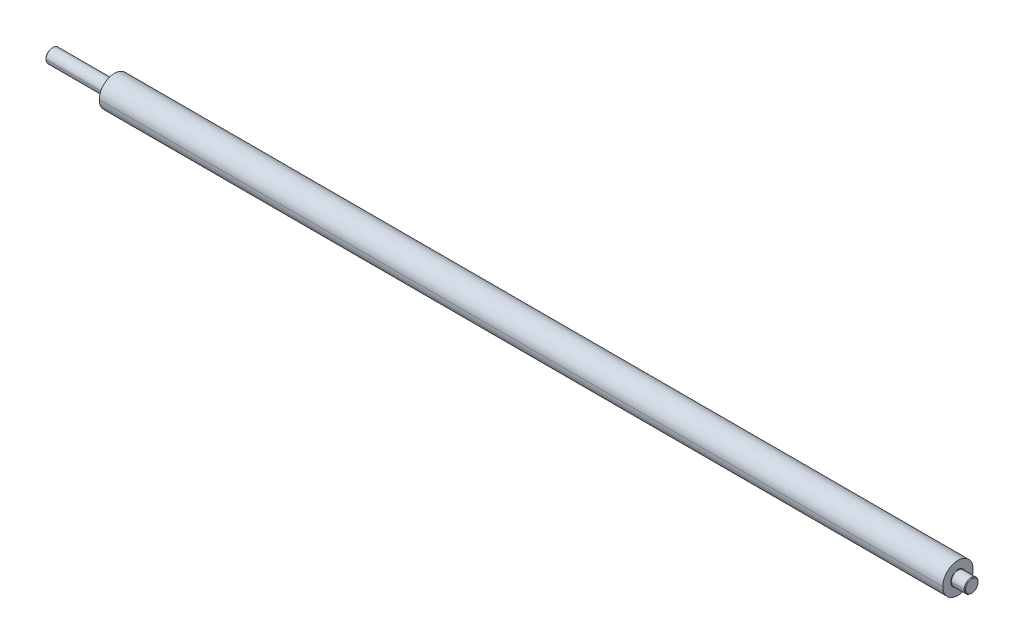
ISO-10303-21;
HEADER;
FILE_DESCRIPTION(('STEP AP214'),'2;1');
FILE_NAME('part.step','',(''),(''),'','','');
FILE_SCHEMA(('AUTOMOTIVE_DESIGN { 1 0 10303 214 1 1 1 1 }'));
ENDSEC;
DATA;
#1=APPLICATION_CONTEXT('core data for automotive mechanical design processes');
#2=APPLICATION_PROTOCOL_DEFINITION('international standard','automotive_design',2000,#1);
#3=PRODUCT_CONTEXT('',#1,'mechanical');
#4=PRODUCT('Part','Part','',(#3));
#5=PRODUCT_RELATED_PRODUCT_CATEGORY('part','',(#4));
#6=PRODUCT_DEFINITION_FORMATION('','',#4);
#7=PRODUCT_DEFINITION_CONTEXT('part definition',#1,'design');
#8=PRODUCT_DEFINITION('design','',#6,#7);
#9=PRODUCT_DEFINITION_SHAPE('','',#8);
#10=(LENGTH_UNIT() NAMED_UNIT(*) SI_UNIT(.MILLI.,.METRE.));
#11=(NAMED_UNIT(*) PLANE_ANGLE_UNIT() SI_UNIT($,.RADIAN.));
#12=(NAMED_UNIT(*) SI_UNIT($,.STERADIAN.) SOLID_ANGLE_UNIT());
#13=UNCERTAINTY_MEASURE_WITH_UNIT(LENGTH_MEASURE(1.E-05),#10,'distance_accuracy_value','');
#14=(GEOMETRIC_REPRESENTATION_CONTEXT(3) GLOBAL_UNCERTAINTY_ASSIGNED_CONTEXT((#13)) GLOBAL_UNIT_ASSIGNED_CONTEXT((#10,
#11,#12)) REPRESENTATION_CONTEXT('',''));
#15=CARTESIAN_POINT('',(0.,0.,0.));
#16=DIRECTION('',(0.,0.,1.));
#17=DIRECTION('',(1.,0.,0.));
#18=AXIS2_PLACEMENT_3D('',#15,#16,#17);
#19=CARTESIAN_POINT('',(45.,0.,0.));
#20=DIRECTION('',(1.,0.,0.));
#21=DIRECTION('',(0.,0.,-1.));
#22=AXIS2_PLACEMENT_3D('',#19,#20,#21);
#23=PLANE('',#22);
#24=CARTESIAN_POINT('',(45.,0.,0.));
#25=DIRECTION('',(1.,0.,0.));
#26=DIRECTION('',(0.,0.,-1.));
#27=AXIS2_PLACEMENT_3D('',#24,#25,#26);
#28=CIRCLE('',#27,11.);
#29=CARTESIAN_POINT('',(45.,0.,11.));
#30=VERTEX_POINT('',#29);
#31=CARTESIAN_POINT('',(45.,0.,-11.));
#32=VERTEX_POINT('',#31);
#33=EDGE_CURVE('E10',#30,#32,#28,.T.);
#34=ORIENTED_EDGE('',*,*,#33,.F.);
#35=CARTESIAN_POINT('',(45.,0.,0.));
#36=DIRECTION('',(1.,0.,0.));
#37=DIRECTION('',(0.,0.,-1.));
#38=AXIS2_PLACEMENT_3D('',#35,#36,#37);
#39=CIRCLE('',#38,11.);
#40=EDGE_CURVE('E25',#32,#30,#39,.T.);
#41=ORIENTED_EDGE('',*,*,#40,.F.);
#42=EDGE_LOOP('',(#34,#41));
#43=FACE_BOUND('',#42,.T.);
#44=CARTESIAN_POINT('',(45.,0.,0.));
#45=DIRECTION('',(1.,0.,0.));
#46=DIRECTION('',(0.,0.,-1.));
#47=AXIS2_PLACEMENT_3D('',#44,#45,#46);
#48=CIRCLE('',#47,5.3);
#49=CARTESIAN_POINT('',(44.9999999999999,5.0405995363642,1.63779007018718));
#50=VERTEX_POINT('',#49);
#51=CARTESIAN_POINT('',(44.9999999999999,-5.0405995363642,-1.63779007018718));
#52=VERTEX_POINT('',#51);
#53=EDGE_CURVE('E250',#50,#52,#48,.T.);
#54=ORIENTED_EDGE('',*,*,#53,.T.);
#55=CARTESIAN_POINT('',(45.,-5.04059953636431,-1.63779007018722));
#56=CARTESIAN_POINT('',(45.,-4.52559033783726,-3.22063693866093));
#57=CARTESIAN_POINT('',(45.,-3.3917749273373,-4.6057664224149));
#58=CARTESIAN_POINT('',(45.,-1.7315428505631,-5.44954277934704));
#59=CARTESIAN_POINT('',(45.,1.83934733064044,-5.66092899865932));
#60=CARTESIAN_POINT('',(45.,4.6040084700311,-3.39099736879158));
#61=CARTESIAN_POINT('',(45.,5.4512051359101,-1.73250802647092));
#62=CARTESIAN_POINT('',(45.,5.55432238842267,0.0545252424096536));
#63=CARTESIAN_POINT('',(45.,5.04059953636431,1.63779007018722));
#64=B_SPLINE_CURVE_WITH_KNOTS('',5,(#55,#56,#57,#58,#59,#60,#61,#62,#63),.UNSPECIFIED.,.F.,.F.,
(6,3,6),(0.,1.5707963267949,3.14159265358979),.UNSPECIFIED.);
#65=EDGE_CURVE('E253',#52,#50,#64,.T.);
#66=ORIENTED_EDGE('',*,*,#65,.T.);
#67=EDGE_LOOP('',(#54,#66));
#68=FACE_BOUND('',#67,.T.);
#69=ADVANCED_FACE('F16',(#43,#68),#23,.F.);
#70=CARTESIAN_POINT('',(44.7,0.,0.));
#71=DIRECTION('',(1.,0.,0.));
#72=DIRECTION('',(0.,-0.309016994374947,0.951056516295154));
#73=AXIS2_PLACEMENT_3D('',#70,#71,#72);
#74=TOROIDAL_SURFACE('',#73,5.29999999999988,0.29999999999988);
#75=CARTESIAN_POINT('',(44.7,-5.0405995363642,-1.63779007018718));
#76=DIRECTION('',(0.,0.309016994374946,-0.951056516295154));
#77=DIRECTION('',(0.,0.951056516295154,0.309016994374946));
#78=AXIS2_PLACEMENT_3D('',#75,#76,#77);
#79=CIRCLE('',#78,0.29999999999988);
#80=CARTESIAN_POINT('',(44.7,-4.75528258147577,-1.54508497187474));
#81=VERTEX_POINT('',#80);
#82=EDGE_CURVE('E260',#81,#52,#79,.T.);
#83=ORIENTED_EDGE('',*,*,#82,.F.);
#84=CARTESIAN_POINT('',(44.7,0.,0.));
#85=DIRECTION('',(1.,0.,0.));
#86=DIRECTION('',(0.,0.,-1.));
#87=AXIS2_PLACEMENT_3D('',#84,#85,#86);
#88=CIRCLE('',#87,5.);
#89=CARTESIAN_POINT('',(44.7,0.,-5.));
#90=VERTEX_POINT('',#89);
#91=EDGE_CURVE('E264',#81,#90,#88,.T.);
#92=ORIENTED_EDGE('',*,*,#91,.T.);
#93=CARTESIAN_POINT('',(44.7,0.,0.));
#94=DIRECTION('',(1.,0.,0.));
#95=DIRECTION('',(0.,0.,-1.));
#96=AXIS2_PLACEMENT_3D('',#93,#94,#95);
#97=CIRCLE('',#96,5.);
#98=CARTESIAN_POINT('',(44.7,4.75528258147577,1.54508497187474));
#99=VERTEX_POINT('',#98);
#100=EDGE_CURVE('E274',#90,#99,#97,.T.);
#101=ORIENTED_EDGE('',*,*,#100,.T.);
#102=CARTESIAN_POINT('',(44.7,5.0405995363642,1.63779007018718));
#103=DIRECTION('',(0.,-0.309016994374946,0.951056516295154));
#104=DIRECTION('',(0.,-0.951056516295154,-0.309016994374946));
#105=AXIS2_PLACEMENT_3D('',#102,#103,#104);
#106=CIRCLE('',#105,0.29999999999988);
#107=EDGE_CURVE('E267',#99,#50,#106,.T.);
#108=ORIENTED_EDGE('',*,*,#107,.T.);
#109=ORIENTED_EDGE('',*,*,#65,.F.);
#110=EDGE_LOOP('',(#83,#92,#101,#108,#109));
#111=FACE_BOUND('',#110,.T.);
#112=ADVANCED_FACE('F242',(#111),#74,.F.);
#113=CARTESIAN_POINT('',(44.7,0.,0.));
#114=DIRECTION('',(1.,0.,0.));
#115=DIRECTION('',(0.,0.309016994374947,-0.951056516295154));
#116=AXIS2_PLACEMENT_3D('',#113,#114,#115);
#117=TOROIDAL_SURFACE('',#116,5.29999999999988,0.29999999999988);
#118=ORIENTED_EDGE('',*,*,#82,.T.);
#119=ORIENTED_EDGE('',*,*,#53,.F.);
#120=ORIENTED_EDGE('',*,*,#107,.F.);
#121=CARTESIAN_POINT('',(44.7,0.,0.));
#122=DIRECTION('',(1.,0.,0.));
#123=DIRECTION('',(0.,0.,-1.));
#124=AXIS2_PLACEMENT_3D('',#121,#122,#123);
#125=CIRCLE('',#124,5.);
#126=CARTESIAN_POINT('',(44.7,0.,5.));
#127=VERTEX_POINT('',#126);
#128=EDGE_CURVE('E275',#99,#127,#125,.T.);
#129=ORIENTED_EDGE('',*,*,#128,.T.);
#130=CARTESIAN_POINT('',(44.7,0.,0.));
#131=DIRECTION('',(1.,0.,0.));
#132=DIRECTION('',(0.,0.,-1.));
#133=AXIS2_PLACEMENT_3D('',#130,#131,#132);
#134=CIRCLE('',#133,5.);
#135=EDGE_CURVE('E262',#127,#81,#134,.T.);
#136=ORIENTED_EDGE('',*,*,#135,.T.);
#137=EDGE_LOOP('',(#118,#119,#120,#129,#136));
#138=FACE_BOUND('',#137,.T.);
#139=ADVANCED_FACE('F246',(#138),#117,.F.);
#140=CARTESIAN_POINT('',(45.,0.,0.));
#141=DIRECTION('',(1.,0.,0.));
#142=DIRECTION('',(0.,1.,0.));
#143=AXIS2_PLACEMENT_3D('',#140,#141,#142);
#144=CYLINDRICAL_SURFACE('',#143,5.);
#145=DIRECTION('',(1.,0.,0.));
#146=VECTOR('',#145,1.);
#147=CARTESIAN_POINT('',(0.5,0.,5.));
#148=LINE('',#147,#146);
#149=CARTESIAN_POINT('',(0.500000000000001,0.,5.));
#150=VERTEX_POINT('',#149);
#151=EDGE_CURVE('E347',#150,#127,#148,.T.);
#152=ORIENTED_EDGE('',*,*,#151,.F.);
#153=CARTESIAN_POINT('',(0.5,0.,0.));
#154=DIRECTION('',(1.,0.,0.));
#155=DIRECTION('',(0.,0.,-1.));
#156=AXIS2_PLACEMENT_3D('',#153,#154,#155);
#157=CIRCLE('',#156,5.);
#158=CARTESIAN_POINT('',(0.5,0.,-5.));
#159=VERTEX_POINT('',#158);
#160=EDGE_CURVE('E343',#150,#159,#157,.T.);
#161=ORIENTED_EDGE('',*,*,#160,.T.);
#162=DIRECTION('',(1.,0.,0.));
#163=VECTOR('',#162,1.);
#164=CARTESIAN_POINT('',(0.5,0.,-5.));
#165=LINE('',#164,#163);
#166=EDGE_CURVE('E338',#159,#90,#165,.T.);
#167=ORIENTED_EDGE('',*,*,#166,.T.);
#168=ORIENTED_EDGE('',*,*,#91,.F.);
#169=ORIENTED_EDGE('',*,*,#135,.F.);
#170=EDGE_LOOP('',(#152,#161,#167,#168,#169));
#171=FACE_BOUND('',#170,.T.);
#172=ADVANCED_FACE('F365',(#171),#144,.T.);
#173=CARTESIAN_POINT('',(45.,0.,0.));
#174=DIRECTION('',(1.,0.,0.));
#175=DIRECTION('',(0.,-1.,0.));
#176=AXIS2_PLACEMENT_3D('',#173,#174,#175);
#177=CYLINDRICAL_SURFACE('',#176,5.);
#178=ORIENTED_EDGE('',*,*,#151,.T.);
#179=ORIENTED_EDGE('',*,*,#128,.F.);
#180=ORIENTED_EDGE('',*,*,#100,.F.);
#181=ORIENTED_EDGE('',*,*,#166,.F.);
#182=CARTESIAN_POINT('',(0.5,0.,0.));
#183=DIRECTION('',(1.,0.,0.));
#184=DIRECTION('',(0.,0.,-1.));
#185=AXIS2_PLACEMENT_3D('',#182,#183,#184);
#186=CIRCLE('',#185,5.);
#187=EDGE_CURVE('E333',#159,#150,#186,.T.);
#188=ORIENTED_EDGE('',*,*,#187,.T.);
#189=EDGE_LOOP('',(#178,#179,#180,#181,#188));
#190=FACE_BOUND('',#189,.T.);
#191=ADVANCED_FACE('F361',(#190),#177,.T.);
#192=CARTESIAN_POINT('',(0.,0.,0.));
#193=DIRECTION('',(1.,0.,0.));
#194=DIRECTION('',(0.,-1.,0.));
#195=AXIS2_PLACEMENT_3D('',#192,#193,#194);
#196=CONICAL_SURFACE('',#195,4.5,0.785398163397448);
#197=DIRECTION('',(0.707106781186548,0.,0.707106781186547));
#198=VECTOR('',#197,1.);
#199=CARTESIAN_POINT('',(0.,0.,4.5));
#200=LINE('',#199,#198);
#201=CARTESIAN_POINT('',(0.,0.,4.5));
#202=VERTEX_POINT('',#201);
#203=EDGE_CURVE('E328',#202,#150,#200,.T.);
#204=ORIENTED_EDGE('',*,*,#203,.T.);
#205=ORIENTED_EDGE('',*,*,#187,.F.);
#206=DIRECTION('',(0.707106781186548,0.,-0.707106781186547));
#207=VECTOR('',#206,1.);
#208=CARTESIAN_POINT('',(0.,0.,-4.5));
#209=LINE('',#208,#207);
#210=CARTESIAN_POINT('',(0.,0.,-4.5));
#211=VERTEX_POINT('',#210);
#212=EDGE_CURVE('E323',#211,#159,#209,.T.);
#213=ORIENTED_EDGE('',*,*,#212,.F.);
#214=CARTESIAN_POINT('',(0.,0.,0.));
#215=DIRECTION('',(1.,0.,0.));
#216=DIRECTION('',(0.,0.,-1.));
#217=AXIS2_PLACEMENT_3D('',#214,#215,#216);
#218=CIRCLE('',#217,4.5);
#219=EDGE_CURVE('E312',#211,#202,#218,.T.);
#220=ORIENTED_EDGE('',*,*,#219,.T.);
#221=EDGE_LOOP('',(#204,#205,#213,#220));
#222=FACE_BOUND('',#221,.T.);
#223=ADVANCED_FACE('F373',(#222),#196,.T.);
#224=CARTESIAN_POINT('',(0.,0.,0.));
#225=DIRECTION('',(1.,0.,0.));
#226=DIRECTION('',(0.,0.,-1.));
#227=AXIS2_PLACEMENT_3D('',#224,#225,#226);
#228=PLANE('',#227);
#229=CARTESIAN_POINT('',(0.,0.,0.));
#230=DIRECTION('',(1.,0.,0.));
#231=DIRECTION('',(0.,0.,-1.));
#232=AXIS2_PLACEMENT_3D('',#229,#230,#231);
#233=CIRCLE('',#232,4.5);
#234=EDGE_CURVE('E309',#202,#211,#233,.T.);
#235=ORIENTED_EDGE('',*,*,#234,.F.);
#236=ORIENTED_EDGE('',*,*,#219,.F.);
#237=EDGE_LOOP('',(#235,#236));
#238=FACE_BOUND('',#237,.T.);
#239=ADVANCED_FACE('F375',(#238),#228,.F.);
#240=CARTESIAN_POINT('',(0.,0.,0.));
#241=DIRECTION('',(1.,0.,0.));
#242=DIRECTION('',(0.,1.,0.));
#243=AXIS2_PLACEMENT_3D('',#240,#241,#242);
#244=CONICAL_SURFACE('',#243,4.5,0.785398163397448);
#245=ORIENTED_EDGE('',*,*,#203,.F.);
#246=ORIENTED_EDGE('',*,*,#234,.T.);
#247=ORIENTED_EDGE('',*,*,#212,.T.);
#248=ORIENTED_EDGE('',*,*,#160,.F.);
#249=EDGE_LOOP('',(#245,#246,#247,#248));
#250=FACE_BOUND('',#249,.T.);
#251=ADVANCED_FACE('F369',(#250),#244,.T.);
#252=CARTESIAN_POINT('',(655.,0.,0.));
#253=DIRECTION('',(1.,0.,0.));
#254=DIRECTION('',(0.,-1.,0.));
#255=AXIS2_PLACEMENT_3D('',#252,#253,#254);
#256=CYLINDRICAL_SURFACE('',#255,11.);
#257=DIRECTION('',(1.,0.,0.));
#258=VECTOR('',#257,1.);
#259=CARTESIAN_POINT('',(45.,0.,11.));
#260=LINE('',#259,#258);
#261=CARTESIAN_POINT('',(655.,0.,11.));
#262=VERTEX_POINT('',#261);
#263=EDGE_CURVE('E300',#30,#262,#260,.T.);
#264=ORIENTED_EDGE('',*,*,#263,.T.);
#265=CARTESIAN_POINT('',(655.,0.,0.));
#266=DIRECTION('',(1.,0.,0.));
#267=DIRECTION('',(0.,0.,-1.));
#268=AXIS2_PLACEMENT_3D('',#265,#266,#267);
#269=CIRCLE('',#268,11.);
#270=CARTESIAN_POINT('',(655.,0.,-11.));
#271=VERTEX_POINT('',#270);
#272=EDGE_CURVE('E305',#271,#262,#269,.T.);
#273=ORIENTED_EDGE('',*,*,#272,.F.);
#274=DIRECTION('',(1.,0.,0.));
#275=VECTOR('',#274,1.);
#276=CARTESIAN_POINT('',(45.,0.,-11.));
#277=LINE('',#276,#275);
#278=EDGE_CURVE('E303',#32,#271,#277,.T.);
#279=ORIENTED_EDGE('',*,*,#278,.F.);
#280=ORIENTED_EDGE('',*,*,#40,.T.);
#281=EDGE_LOOP('',(#264,#273,#279,#280));
#282=FACE_BOUND('',#281,.T.);
#283=ADVANCED_FACE('F299',(#282),#256,.T.);
#284=CARTESIAN_POINT('',(655.,0.,0.));
#285=DIRECTION('',(1.,0.,0.));
#286=DIRECTION('',(0.,1.,0.));
#287=AXIS2_PLACEMENT_3D('',#284,#285,#286);
#288=CYLINDRICAL_SURFACE('',#287,11.);
#289=ORIENTED_EDGE('',*,*,#263,.F.);
#290=ORIENTED_EDGE('',*,*,#33,.T.);
#291=ORIENTED_EDGE('',*,*,#278,.T.);
#292=CARTESIAN_POINT('',(655.,0.,0.));
#293=DIRECTION('',(1.,0.,0.));
#294=DIRECTION('',(0.,0.,-1.));
#295=AXIS2_PLACEMENT_3D('',#292,#293,#294);
#296=CIRCLE('',#295,11.);
#297=EDGE_CURVE('E221',#262,#271,#296,.T.);
#298=ORIENTED_EDGE('',*,*,#297,.F.);
#299=EDGE_LOOP('',(#289,#290,#291,#298));
#300=FACE_BOUND('',#299,.T.);
#301=ADVANCED_FACE('F190',(#300),#288,.T.);
#302=CARTESIAN_POINT('',(655.,11.,0.));
#303=DIRECTION('',(-1.,0.,0.));
#304=DIRECTION('',(0.,0.,1.));
#305=AXIS2_PLACEMENT_3D('',#302,#303,#304);
#306=PLANE('',#305);
#307=CARTESIAN_POINT('',(655.000000000007,5.04059953635766,1.63779007018506));
#308=CARTESIAN_POINT('',(655.000000000007,5.01380298147387,1.72026733897911));
#309=CARTESIAN_POINT('',(655.000000000007,4.98497875743653,1.80208561354296));
#310=CARTESIAN_POINT('',(655.000000000007,4.92335196993028,1.96420994002448));
#311=CARTESIAN_POINT('',(655.000000000007,4.89054940646136,2.04451599194214));
#312=CARTESIAN_POINT('',(655.000000000007,4.82104293896746,2.20342163894554));
#313=CARTESIAN_POINT('',(655.000000000007,4.78433903494247,2.28202123403126));
#314=CARTESIAN_POINT('',(655.000000000007,4.70711885195318,2.43732482034847));
#315=CARTESIAN_POINT('',(655.000000000007,4.66660257298888,2.51402881157995));
#316=CARTESIAN_POINT('',(655.000000000007,4.58185510197056,2.66535634828093));
#317=CARTESIAN_POINT('',(655.000000000007,4.53762390991653,2.73997989375044));
#318=CARTESIAN_POINT('',(655.000000000007,4.4455532084985,2.88696677908092));
#319=CARTESIAN_POINT('',(655.000000000007,4.39771369913449,2.9593301189419));
#320=CARTESIAN_POINT('',(655.000000000007,4.29854160222447,3.10162225946278));
#321=CARTESIAN_POINT('',(655.000000000007,4.24720901467845,3.1715510601227));
#322=CARTESIAN_POINT('',(655.000000000007,4.14117442890147,3.30880565869899));
#323=CARTESIAN_POINT('',(655.000000000007,4.08647243067052,3.37613145661538));
#324=CARTESIAN_POINT('',(655.000000000007,3.97383080467916,3.50801785567547));
#325=CARTESIAN_POINT('',(655.000000000007,3.91589117691876,3.57257845681918));
#326=CARTESIAN_POINT('',(655.000000000007,3.79691387370755,3.69877893026726));
#327=CARTESIAN_POINT('',(655.000000000007,3.73587619825673,3.76041880257163));
#328=CARTESIAN_POINT('',(655.000000000007,3.61084984471731,3.88062932246921));
#329=CARTESIAN_POINT('',(655.000000000007,3.5468611666287,3.9391999700624));
#330=CARTESIAN_POINT('',(655.000000000007,3.41608696215835,4.05313093872286));
#331=CARTESIAN_POINT('',(655.000000000007,3.34930143577662,4.10849125979011));
#332=CARTESIAN_POINT('',(655.000000000007,3.21309442689896,4.21586820753478));
#333=CARTESIAN_POINT('',(655.000000000007,3.14367294440302,4.26788483421219));
#334=CARTESIAN_POINT('',(655.000000000007,3.00236126572991,4.36844908056778));
#335=CARTESIAN_POINT('',(655.000000000007,2.93047106955274,4.41699670024596));
#336=CARTESIAN_POINT('',(655.000000000007,2.78439515329632,4.51050597713489));
#337=CARTESIAN_POINT('',(655.000000000007,2.71020943321706,4.55546763434564));
#338=CARTESIAN_POINT('',(655.000000000007,2.55972118905412,4.64169666972937));
#339=CARTESIAN_POINT('',(655.000000000007,2.48341866497043,4.68296404790234));
#340=CARTESIAN_POINT('',(655.000000000007,2.32888063226242,4.76170510848188));
#341=CARTESIAN_POINT('',(655.000000000007,2.2506451236381,4.79917879088844));
#342=CARTESIAN_POINT('',(655.000000000007,2.09242959804174,4.87024218255194));
#343=CARTESIAN_POINT('',(655.000000000007,2.0124495810697,4.90383189180887));
#344=CARTESIAN_POINT('',(655.000000000007,1.85093771764419,4.9670464166214));
#345=CARTESIAN_POINT('',(655.000000000007,1.76940587119073,4.996671232177));
#346=CARTESIAN_POINT('',(655.000000000007,1.60498676616185,5.05188460081134));
#347=CARTESIAN_POINT('',(655.000000000007,1.52209950758642,5.07747315389009));
#348=CARTESIAN_POINT('',(655.000000000007,1.35516926097958,5.12455235250509));
#349=CARTESIAN_POINT('',(655.000000000007,1.27112627294816,5.14604299804134));
#350=CARTESIAN_POINT('',(655.000000000007,1.1020870343488,5.18487460872389));
#351=CARTESIAN_POINT('',(655.000000000007,1.01709078378086,5.20221557387018));
#352=CARTESIAN_POINT('',(655.000000000007,0.846349783520853,5.23270604786889));
#353=CARTESIAN_POINT('',(655.000000000007,0.760605033828793,5.2458555567213));
#354=CARTESIAN_POINT('',(655.000000000007,0.588573601932919,5.26793143981365));
#355=CARTESIAN_POINT('',(655.000000000007,0.502286919729104,5.27685781405359));
#356=CARTESIAN_POINT('',(655.000000000007,0.329379494984969,5.29046592350361));
#357=CARTESIAN_POINT('',(655.000000000007,0.242758752444648,5.29514765871368));
#358=CARTESIAN_POINT('',(655.000000000007,0.0693918839833636,5.30025521139375));
#359=CARTESIAN_POINT('',(655.000000000007,-0.0173542419376003,5.30068102886376));
#360=CARTESIAN_POINT('',(655.000000000007,-0.190762898144767,5.29727572023213));
#361=CARTESIAN_POINT('',(655.000000000007,-0.27742542843097,5.29344459413049));
#362=CARTESIAN_POINT('',(655.000000000007,-0.450458115742413,5.28153462787391));
#363=CARTESIAN_POINT('',(655.000000000007,-0.536828272767652,5.27345578771897));
#364=CARTESIAN_POINT('',(655.000000000007,-0.709068140283764,5.25306985598935));
#365=CARTESIAN_POINT('',(655.000000000007,-0.794937850774635,5.24076276441466));
#366=CARTESIAN_POINT('',(655.000000000007,-0.965969957568138,5.21194997870713));
#367=CARTESIAN_POINT('',(655.000000000007,-1.05113235387077,5.19544428457428));
#368=CARTESIAN_POINT('',(655.000000000007,-1.22054466861575,5.1582740574133));
#369=CARTESIAN_POINT('',(655.000000000007,-1.3047945870581,5.13760952438518));
#370=CARTESIAN_POINT('',(655.000000000007,-1.47217898064958,5.09217140210372));
#371=CARTESIAN_POINT('',(655.000000000007,-1.55531345579871,5.06739781285039));
#372=CARTESIAN_POINT('',(655.000000000007,-1.72026668457138,5.01380125986493));
#373=CARTESIAN_POINT('',(655.000000000007,-1.80208543819493,4.98497829613281));
#374=CARTESIAN_POINT('',(655.000000000007,-1.96421011537249,4.92335243123401));
#375=CARTESIAN_POINT('',(655.000000000007,-2.04451603892649,4.89054953006732));
#376=CARTESIAN_POINT('',(655.000000000007,-2.20342159196117,4.8210428153615));
#377=CARTESIAN_POINT('',(655.000000000007,-2.28202122144183,4.78433900182236));
#378=CARTESIAN_POINT('',(655.000000000007,-2.43732483293788,4.70711888507331));
#379=CARTESIAN_POINT('',(655.000000000007,-2.51402881495326,4.6666025818634));
#380=CARTESIAN_POINT('',(655.000000000007,-2.6653563449076,4.58185509309605));
#381=CARTESIAN_POINT('',(655.000000000007,-2.73997989284655,4.53762390753861));
#382=CARTESIAN_POINT('',(655.000000000007,-2.8869667799848,4.44555321087642));
#383=CARTESIAN_POINT('',(655.000000000007,-2.95933011918408,4.39771369977166));
#384=CARTESIAN_POINT('',(655.000000000007,-3.10162225922058,4.29854160158731));
#385=CARTESIAN_POINT('',(655.000000000007,-3.17155106005779,4.24720901450773));
#386=CARTESIAN_POINT('',(655.000000000007,-3.30880565876388,4.14117442907221));
#387=CARTESIAN_POINT('',(655.000000000007,-3.37613145663276,4.08647243071627));
#388=CARTESIAN_POINT('',(655.000000000007,-3.50801785565807,3.97383080463343));
#389=CARTESIAN_POINT('',(655.000000000007,-3.57257845681451,3.91589117690651));
#390=CARTESIAN_POINT('',(655.000000000007,-3.69877893027191,3.79691387371981));
#391=CARTESIAN_POINT('',(655.000000000007,-3.76041880257288,3.73587619826003));
#392=CARTESIAN_POINT('',(655.000000000007,-3.88062932246795,3.61084984471403));
#393=CARTESIAN_POINT('',(655.000000000007,-3.93919997006206,3.54686116662782));
#394=CARTESIAN_POINT('',(655.000000000007,-4.05313093872318,3.41608696215924));
#395=CARTESIAN_POINT('',(655.000000000007,-4.1084912597902,3.34930143577687));
#396=CARTESIAN_POINT('',(655.000000000007,-4.21586820753469,3.21309442689873));
#397=CARTESIAN_POINT('',(655.000000000007,-4.26788483421217,3.14367294440296));
#398=CARTESIAN_POINT('',(655.000000000007,-4.3684490805678,3.00236126572998));
#399=CARTESIAN_POINT('',(655.000000000007,-4.41699670024596,2.93047106955277));
#400=CARTESIAN_POINT('',(655.000000000007,-4.51050597713487,2.78439515329631));
#401=CARTESIAN_POINT('',(655.000000000007,-4.55546763434563,2.71020943321707));
#402=CARTESIAN_POINT('',(655.000000000007,-4.64169666972937,2.55972118905413));
#403=CARTESIAN_POINT('',(655.000000000007,-4.68296404790234,2.48341866497044));
#404=CARTESIAN_POINT('',(655.000000000007,-4.76170510848187,2.32888063226243));
#405=CARTESIAN_POINT('',(655.000000000007,-4.79917879088843,2.25064512363811));
#406=CARTESIAN_POINT('',(655.000000000007,-4.87024218255194,2.09242959804175));
#407=CARTESIAN_POINT('',(655.000000000007,-4.90383189180889,2.0124495810697));
#408=CARTESIAN_POINT('',(655.000000000007,-4.96704641662138,1.85093771764421));
#409=CARTESIAN_POINT('',(655.000000000007,-4.99667123217693,1.76940587119076));
#410=CARTESIAN_POINT('',(655.000000000007,-5.0518846008114,1.60498676616184));
#411=CARTESIAN_POINT('',(655.000000000007,-5.07747315389033,1.52209950758636));
#412=CARTESIAN_POINT('',(655.000000000007,-5.12455235250485,1.35516926097965));
#413=CARTESIAN_POINT('',(655.000000000007,-5.14604299804043,1.27112627294842));
#414=CARTESIAN_POINT('',(655.000000000007,-5.18487460872479,1.10208703434857));
#415=CARTESIAN_POINT('',(655.000000000007,-5.20221557387357,1.01709078377995));
#416=CARTESIAN_POINT('',(655.000000000007,-5.23270604786549,0.846349783521784));
#417=CARTESIAN_POINT('',(655.000000000007,-5.24585555670864,0.760605033832241));
#418=CARTESIAN_POINT('',(655.000000000007,-5.2679314398263,0.588573601929496));
#419=CARTESIAN_POINT('',(655.000000000007,-5.27685781410082,0.502286919716294));
#420=CARTESIAN_POINT('',(655.000000000007,-5.29046592345637,0.3293794949978));
#421=CARTESIAN_POINT('',(655.000000000007,-5.29514765853741,0.242758752492508));
#422=CARTESIAN_POINT('',(655.000000000007,-5.30025521157002,0.0693918839355258));
#423=CARTESIAN_POINT('',(655.000000000007,-5.30068102952159,-0.0173542421161647));
#424=CARTESIAN_POINT('',(655.000000000007,-5.2972757195743,-0.190762897966182));
#425=CARTESIAN_POINT('',(655.000000000007,-5.29344459167543,-0.277425427764508));
#426=CARTESIAN_POINT('',(655.000000000007,-5.28153463032897,-0.450458116408852));
#427=CARTESIAN_POINT('',(655.000000000007,-5.27345579688139,-0.536828275254868));
#428=CARTESIAN_POINT('',(655.000000000007,-5.25306984682693,-0.709068137796523));
#429=CARTESIAN_POINT('',(655.000000000007,-5.24076273022005,-0.794937841492161));
#430=CARTESIAN_POINT('',(655.000000000007,-5.21195001290174,-0.965969966850584));
#431=CARTESIAN_POINT('',(655.000000000007,-5.19544441219032,-1.05113238851337));
#432=CARTESIAN_POINT('',(655.000000000007,-5.15827392979727,-1.22054463397312));
#433=CARTESIAN_POINT('',(655.000000000007,-5.13760904811565,-1.30479445777009));
#434=CARTESIAN_POINT('',(655.000000000007,-5.09217187837326,-1.47217910993757));
#435=CARTESIAN_POINT('',(655.000000000007,-5.06739959031249,-1.55531393830808));
#436=CARTESIAN_POINT('',(655.000000000007,-5.04059953635766,-1.63779007018504));
#437=B_SPLINE_CURVE_WITH_KNOTS('',3,(#307,#308,#309,#310,#311,#312,#313,#314,#315,#316,#317,
#318,#319,#320,#321,#322,#323,#324,#325,#326,#327,#328,#329,#330,#331,#332,#333,#334,#335,#336,
#337,#338,#339,#340,#341,#342,#343,#344,#345,#346,#347,#348,#349,#350,#351,#352,#353,#354,#355,
#356,#357,#358,#359,#360,#361,#362,#363,#364,#365,#366,#367,#368,#369,#370,#371,#372,#373,#374,
#375,#376,#377,#378,#379,#380,#381,#382,#383,#384,#385,#386,#387,#388,#389,#390,#391,#392,#393,
#394,#395,#396,#397,#398,#399,#400,#401,#402,#403,#404,#405,#406,#407,#408,#409,#410,#411,#412,
#413,#414,#415,#416,#417,#418,#419,#420,#421,#422,#423,#424,#425,#426,#427,#428,#429,#430,#431,
#432,#433,#434,#435,#436),.UNSPECIFIED.,.F.,.F.,(4,2,2,2,2,2,2,2,2,2,2,2,2,2,2,2,2,2,2,2,2,2,2,
2,2,2,2,2,2,2,2,2,2,2,2,2,2,2,2,2,2,2,2,2,2,2,2,2,2,2,2,2,2,2,2,2,2,2,2,2,2,2,2,2,4),(0.,
0.260137022342527,0.520274044685053,0.78041106702758,1.04054808937011,1.30068511171263,
1.56082213405516,1.82095915639768,2.08109617874021,2.34123320108274,2.60137022342526,
2.86150724576779,3.12164426811032,3.38178129045284,3.64191831279537,3.9020553351379,
4.16219235748042,4.42232937982295,4.68246640216547,4.942603424508,5.20274044685053,
5.46287746919306,5.72301449153558,5.98315151387811,6.24328853622063,6.50342555856316,
6.76356258090568,7.02369960324821,7.28383662559074,7.54397364793327,7.80411067027579,
8.06424769261831,8.32438471496084,8.58452173730337,8.8446587596459,9.10479578198842,
9.36493280433095,9.62506982667347,9.885206849016,10.1453438713585,10.4054808937011,
10.6656179160436,10.9257549383861,11.1858919607286,11.4460289830712,11.7061660054137,
11.9663030277562,12.2264400500987,12.4865770724413,12.7467140947838,13.0068511171263,
13.2669881394688,13.5271251618114,13.7872621841539,14.0473992064964,14.3075362288389,
14.5676732511815,14.827810273524,15.0879472958665,15.3480843182091,15.6082213405516,
15.8683583628941,16.1284953852366,16.3886324075792,16.6487694299217),.UNSPECIFIED.);
#438=CARTESIAN_POINT('',(655.000000000007,5.04059953635766,1.63779007018506));
#439=VERTEX_POINT('',#438);
#440=CARTESIAN_POINT('',(655.000000000007,-5.04059953635766,-1.63779007018506));
#441=VERTEX_POINT('',#440);
#442=EDGE_CURVE('E213',#439,#441,#437,.T.);
#443=ORIENTED_EDGE('',*,*,#442,.F.);
#444=CARTESIAN_POINT('',(655.000000000007,-5.04059953635766,-1.63779007018506));
#445=CARTESIAN_POINT('',(655.000000000007,-5.01380298147387,-1.72026733897911));
#446=CARTESIAN_POINT('',(655.000000000007,-4.98497875743653,-1.80208561354296));
#447=CARTESIAN_POINT('',(655.000000000007,-4.92335196993028,-1.96420994002448));
#448=CARTESIAN_POINT('',(655.000000000007,-4.89054940646136,-2.04451599194214));
#449=CARTESIAN_POINT('',(655.000000000007,-4.82104293896746,-2.20342163894554));
#450=CARTESIAN_POINT('',(655.000000000007,-4.78433903494247,-2.28202123403126));
#451=CARTESIAN_POINT('',(655.000000000007,-4.70711885195318,-2.43732482034846));
#452=CARTESIAN_POINT('',(655.000000000007,-4.66660257298888,-2.51402881157994));
#453=CARTESIAN_POINT('',(655.000000000007,-4.58185510197055,-2.66535634828093));
#454=CARTESIAN_POINT('',(655.000000000007,-4.53762390991653,-2.73997989375044));
#455=CARTESIAN_POINT('',(655.000000000007,-4.4455532084985,-2.88696677908092));
#456=CARTESIAN_POINT('',(655.000000000007,-4.39771369913449,-2.9593301189419));
#457=CARTESIAN_POINT('',(655.000000000007,-4.29854160222447,-3.10162225946278));
#458=CARTESIAN_POINT('',(655.000000000007,-4.24720901467845,-3.1715510601227));
#459=CARTESIAN_POINT('',(655.000000000007,-4.14117442890148,-3.30880565869899));
#460=CARTESIAN_POINT('',(655.000000000007,-4.08647243067052,-3.37613145661538));
#461=CARTESIAN_POINT('',(655.000000000007,-3.97383080467917,-3.50801785567547));
#462=CARTESIAN_POINT('',(655.000000000007,-3.91589117691876,-3.57257845681918));
#463=CARTESIAN_POINT('',(655.000000000007,-3.79691387370755,-3.69877893026726));
#464=CARTESIAN_POINT('',(655.000000000007,-3.73587619825673,-3.76041880257163));
#465=CARTESIAN_POINT('',(655.000000000007,-3.61084984471731,-3.88062932246921));
#466=CARTESIAN_POINT('',(655.000000000007,-3.5468611666287,-3.9391999700624));
#467=CARTESIAN_POINT('',(655.000000000007,-3.41608696215835,-4.05313093872285));
#468=CARTESIAN_POINT('',(655.000000000007,-3.34930143577662,-4.10849125979011));
#469=CARTESIAN_POINT('',(655.000000000007,-3.21309442689896,-4.21586820753478));
#470=CARTESIAN_POINT('',(655.000000000007,-3.14367294440302,-4.26788483421219));
#471=CARTESIAN_POINT('',(655.000000000007,-3.00236126572992,-4.36844908056778));
#472=CARTESIAN_POINT('',(655.000000000007,-2.93047106955275,-4.41699670024595));
#473=CARTESIAN_POINT('',(655.000000000007,-2.78439515329632,-4.51050597713488));
#474=CARTESIAN_POINT('',(655.000000000007,-2.71020943321707,-4.55546763434564));
#475=CARTESIAN_POINT('',(655.000000000007,-2.55972118905412,-4.64169666972937));
#476=CARTESIAN_POINT('',(655.000000000007,-2.48341866497043,-4.68296404790234));
#477=CARTESIAN_POINT('',(655.000000000007,-2.32888063226242,-4.76170510848188));
#478=CARTESIAN_POINT('',(655.000000000007,-2.2506451236381,-4.79917879088844));
#479=CARTESIAN_POINT('',(655.000000000007,-2.09242959804174,-4.87024218255194));
#480=CARTESIAN_POINT('',(655.000000000007,-2.0124495810697,-4.90383189180887));
#481=CARTESIAN_POINT('',(655.000000000007,-1.8509377176442,-4.9670464166214));
#482=CARTESIAN_POINT('',(655.000000000007,-1.76940587119074,-4.99667123217699));
#483=CARTESIAN_POINT('',(655.000000000007,-1.60498676616185,-5.05188460081134));
#484=CARTESIAN_POINT('',(655.000000000007,-1.52209950758642,-5.07747315389009));
#485=CARTESIAN_POINT('',(655.000000000007,-1.35516926097958,-5.12455235250509));
#486=CARTESIAN_POINT('',(655.000000000007,-1.27112627294816,-5.14604299804134));
#487=CARTESIAN_POINT('',(655.000000000007,-1.1020870343488,-5.18487460872389));
#488=CARTESIAN_POINT('',(655.000000000007,-1.01709078378086,-5.20221557387018));
#489=CARTESIAN_POINT('',(655.000000000007,-0.846349783520858,-5.23270604786889));
#490=CARTESIAN_POINT('',(655.000000000007,-0.760605033828798,-5.2458555567213));
#491=CARTESIAN_POINT('',(655.000000000007,-0.588573601932924,-5.26793143981365));
#492=CARTESIAN_POINT('',(655.000000000007,-0.50228691972911,-5.27685781405359));
#493=CARTESIAN_POINT('',(655.000000000007,-0.329379494984974,-5.29046592350361));
#494=CARTESIAN_POINT('',(655.000000000007,-0.242758752444653,-5.29514765871368));
#495=CARTESIAN_POINT('',(655.000000000007,-0.0693918839833679,-5.30025521139375));
#496=CARTESIAN_POINT('',(655.000000000007,0.0173542419375967,-5.30068102886376));
#497=CARTESIAN_POINT('',(655.000000000007,0.190762898144764,-5.29727572023213));
#498=CARTESIAN_POINT('',(655.000000000007,0.277425428430966,-5.29344459413049));
#499=CARTESIAN_POINT('',(655.000000000007,0.450458115742408,-5.28153462787391));
#500=CARTESIAN_POINT('',(655.000000000007,0.536828272767647,-5.27345578771897));
#501=CARTESIAN_POINT('',(655.000000000007,0.709068140283757,-5.25306985598935));
#502=CARTESIAN_POINT('',(655.000000000007,0.794937850774627,-5.24076276441466));
#503=CARTESIAN_POINT('',(655.000000000007,0.965969957568129,-5.21194997870713));
#504=CARTESIAN_POINT('',(655.000000000007,1.05113235387076,-5.19544428457428));
#505=CARTESIAN_POINT('',(655.000000000007,1.22054466861575,-5.1582740574133));
#506=CARTESIAN_POINT('',(655.000000000007,1.3047945870581,-5.13760952438518));
#507=CARTESIAN_POINT('',(655.000000000007,1.47217898064958,-5.09217140210372));
#508=CARTESIAN_POINT('',(655.000000000007,1.55531345579871,-5.06739781285039));
#509=CARTESIAN_POINT('',(655.000000000007,1.72026668457138,-5.01380125986493));
#510=CARTESIAN_POINT('',(655.000000000007,1.80208543819493,-4.98497829613281));
#511=CARTESIAN_POINT('',(655.000000000007,1.96421011537248,-4.92335243123401));
#512=CARTESIAN_POINT('',(655.000000000007,2.04451603892649,-4.89054953006733));
#513=CARTESIAN_POINT('',(655.000000000007,2.20342159196116,-4.8210428153615));
#514=CARTESIAN_POINT('',(655.000000000007,2.28202122144183,-4.78433900182236));
#515=CARTESIAN_POINT('',(655.000000000007,2.43732483293787,-4.70711888507331));
#516=CARTESIAN_POINT('',(655.000000000007,2.51402881495326,-4.6666025818634));
#517=CARTESIAN_POINT('',(655.000000000007,2.66535634490759,-4.58185509309605));
#518=CARTESIAN_POINT('',(655.000000000007,2.73997989284655,-4.53762390753862));
#519=CARTESIAN_POINT('',(655.000000000007,2.88696677998479,-4.44555321087642));
#520=CARTESIAN_POINT('',(655.000000000007,2.95933011918408,-4.39771369977166));
#521=CARTESIAN_POINT('',(655.000000000007,3.10162225922058,-4.29854160158732));
#522=CARTESIAN_POINT('',(655.000000000007,3.17155106005779,-4.24720901450773));
#523=CARTESIAN_POINT('',(655.000000000007,3.30880565876388,-4.14117442907221));
#524=CARTESIAN_POINT('',(655.000000000007,3.37613145663276,-4.08647243071628));
#525=CARTESIAN_POINT('',(655.000000000007,3.50801785565807,-3.97383080463343));
#526=CARTESIAN_POINT('',(655.000000000007,3.5725784568145,-3.91589117690652));
#527=CARTESIAN_POINT('',(655.000000000007,3.69877893027191,-3.79691387371982));
#528=CARTESIAN_POINT('',(655.000000000007,3.76041880257287,-3.73587619826003));
#529=CARTESIAN_POINT('',(655.000000000007,3.88062932246795,-3.61084984471404));
#530=CARTESIAN_POINT('',(655.000000000007,3.93919997006206,-3.54686116662783));
#531=CARTESIAN_POINT('',(655.000000000007,4.05313093872318,-3.41608696215925));
#532=CARTESIAN_POINT('',(655.000000000007,4.10849125979019,-3.34930143577687));
#533=CARTESIAN_POINT('',(655.000000000007,4.21586820753468,-3.21309442689874));
#534=CARTESIAN_POINT('',(655.000000000007,4.26788483421216,-3.14367294440297));
#535=CARTESIAN_POINT('',(655.000000000007,4.36844908056779,-3.00236126572999));
#536=CARTESIAN_POINT('',(655.000000000007,4.41699670024595,-2.93047106955278));
#537=CARTESIAN_POINT('',(655.000000000007,4.51050597713487,-2.78439515329632));
#538=CARTESIAN_POINT('',(655.000000000007,4.55546763434563,-2.71020943321708));
#539=CARTESIAN_POINT('',(655.000000000007,4.64169666972936,-2.55972118905414));
#540=CARTESIAN_POINT('',(655.000000000007,4.68296404790234,-2.48341866497045));
#541=CARTESIAN_POINT('',(655.000000000007,4.76170510848187,-2.32888063226243));
#542=CARTESIAN_POINT('',(655.000000000007,4.79917879088843,-2.25064512363812));
#543=CARTESIAN_POINT('',(655.000000000007,4.87024218255194,-2.09242959804175));
#544=CARTESIAN_POINT('',(655.000000000007,4.90383189180889,-2.01244958106971));
#545=CARTESIAN_POINT('',(655.000000000007,4.96704641662138,-1.85093771764422));
#546=CARTESIAN_POINT('',(655.000000000007,4.99667123217692,-1.76940587119077));
#547=CARTESIAN_POINT('',(655.000000000007,5.0518846008114,-1.60498676616185));
#548=CARTESIAN_POINT('',(655.000000000007,5.07747315389033,-1.52209950758637));
#549=CARTESIAN_POINT('',(655.000000000007,5.12455235250484,-1.35516926097966));
#550=CARTESIAN_POINT('',(655.000000000007,5.14604299804043,-1.27112627294843));
#551=CARTESIAN_POINT('',(655.000000000007,5.18487460872479,-1.10208703434857));
#552=CARTESIAN_POINT('',(655.000000000007,5.20221557387357,-1.01709078377995));
#553=CARTESIAN_POINT('',(655.000000000007,5.23270604786549,-0.846349783521792));
#554=CARTESIAN_POINT('',(655.000000000007,5.24585555670864,-0.760605033832248));
#555=CARTESIAN_POINT('',(655.000000000007,5.2679314398263,-0.588573601929503));
#556=CARTESIAN_POINT('',(655.000000000007,5.27685781410082,-0.502286919716303));
#557=CARTESIAN_POINT('',(655.000000000007,5.29046592345637,-0.32937949499781));
#558=CARTESIAN_POINT('',(655.000000000007,5.29514765853741,-0.242758752492518));
#559=CARTESIAN_POINT('',(655.000000000007,5.30025521157002,-0.0693918839355359));
#560=CARTESIAN_POINT('',(655.000000000007,5.30068102952159,0.0173542421161545));
#561=CARTESIAN_POINT('',(655.000000000007,5.2972757195743,0.190762897966172));
#562=CARTESIAN_POINT('',(655.000000000007,5.29344459167543,0.277425427764498));
#563=CARTESIAN_POINT('',(655.000000000007,5.28153463032897,0.450458116408841));
#564=CARTESIAN_POINT('',(655.000000000007,5.27345579688139,0.536828275254858));
#565=CARTESIAN_POINT('',(655.000000000007,5.25306984682693,0.709068137796514));
#566=CARTESIAN_POINT('',(655.000000000007,5.24076273022005,0.794937841492154));
#567=CARTESIAN_POINT('',(655.000000000007,5.21195001290174,0.965969966850578));
#568=CARTESIAN_POINT('',(655.000000000007,5.19544441219032,1.05113238851336));
#569=CARTESIAN_POINT('',(655.000000000007,5.15827392979727,1.22054463397312));
#570=CARTESIAN_POINT('',(655.000000000007,5.13760904811565,1.30479445777009));
#571=CARTESIAN_POINT('',(655.000000000007,5.09217187837326,1.47217910993757));
#572=CARTESIAN_POINT('',(655.000000000007,5.06739959031249,1.55531393830807));
#573=CARTESIAN_POINT('',(655.000000000007,5.04059953635766,1.63779007018503));
#574=B_SPLINE_CURVE_WITH_KNOTS('',3,(#444,#445,#446,#447,#448,#449,#450,#451,#452,#453,#454,
#455,#456,#457,#458,#459,#460,#461,#462,#463,#464,#465,#466,#467,#468,#469,#470,#471,#472,#473,
#474,#475,#476,#477,#478,#479,#480,#481,#482,#483,#484,#485,#486,#487,#488,#489,#490,#491,#492,
#493,#494,#495,#496,#497,#498,#499,#500,#501,#502,#503,#504,#505,#506,#507,#508,#509,#510,#511,
#512,#513,#514,#515,#516,#517,#518,#519,#520,#521,#522,#523,#524,#525,#526,#527,#528,#529,#530,
#531,#532,#533,#534,#535,#536,#537,#538,#539,#540,#541,#542,#543,#544,#545,#546,#547,#548,#549,
#550,#551,#552,#553,#554,#555,#556,#557,#558,#559,#560,#561,#562,#563,#564,#565,#566,#567,#568,
#569,#570,#571,#572,#573),.UNSPECIFIED.,.F.,.F.,(4,2,2,2,2,2,2,2,2,2,2,2,2,2,2,2,2,2,2,2,2,2,2,
2,2,2,2,2,2,2,2,2,2,2,2,2,2,2,2,2,2,2,2,2,2,2,2,2,2,2,2,2,2,2,2,2,2,2,2,2,2,2,2,2,4),(0.,
0.260137022342527,0.520274044685052,0.780411067027578,1.0405480893701,1.30068511171263,
1.56082213405516,1.82095915639768,2.08109617874021,2.34123320108274,2.60137022342526,
2.86150724576779,3.12164426811031,3.38178129045284,3.64191831279537,3.90205533513789,
4.16219235748042,4.42232937982295,4.68246640216547,4.942603424508,5.20274044685052,
5.46287746919305,5.72301449153558,5.9831515138781,6.24328853622063,6.50342555856315,
6.76356258090568,7.02369960324821,7.28383662559073,7.54397364793326,7.80411067027579,
8.06424769261831,8.32438471496084,8.58452173730336,8.84465875964589,9.10479578198842,
9.36493280433094,9.62506982667347,9.885206849016,10.1453438713585,10.405480893701,
10.6656179160436,10.9257549383861,11.1858919607286,11.4460289830712,11.7061660054137,
11.9663030277562,12.2264400500987,12.4865770724413,12.7467140947838,13.0068511171263,
13.2669881394688,13.5271251618114,13.7872621841539,14.0473992064964,14.3075362288389,
14.5676732511815,14.827810273524,15.0879472958665,15.348084318209,15.6082213405516,
15.8683583628941,16.1284953852366,16.3886324075792,16.6487694299217),.UNSPECIFIED.);
#575=EDGE_CURVE('E209',#441,#439,#574,.T.);
#576=ORIENTED_EDGE('',*,*,#575,.F.);
#577=EDGE_LOOP('',(#443,#576));
#578=FACE_BOUND('',#577,.T.);
#579=ORIENTED_EDGE('',*,*,#272,.T.);
#580=ORIENTED_EDGE('',*,*,#297,.T.);
#581=EDGE_LOOP('',(#579,#580));
#582=FACE_BOUND('',#581,.T.);
#583=ADVANCED_FACE('F184',(#578,#582),#306,.F.);
#584=CARTESIAN_POINT('',(655.3,0.,0.));
#585=DIRECTION('',(1.,0.,0.));
#586=DIRECTION('',(0.,-0.309016994374947,0.951056516295154));
#587=AXIS2_PLACEMENT_3D('',#584,#585,#586);
#588=TOROIDAL_SURFACE('',#587,5.299999999993,0.299999999992972);
#589=CARTESIAN_POINT('',(655.3,-5.04059953635766,-1.63779007018506));
#590=DIRECTION('',(0.,0.309016994374947,-0.951056516295154));
#591=DIRECTION('',(-1.,0.,0.));
#592=AXIS2_PLACEMENT_3D('',#589,#590,#591);
#593=CIRCLE('',#592,0.29999999999302);
#594=CARTESIAN_POINT('',(655.3,-4.75528258147579,-1.54508497187474));
#595=VERTEX_POINT('',#594);
#596=EDGE_CURVE('E164',#441,#595,#593,.T.);
#597=ORIENTED_EDGE('',*,*,#596,.F.);
#598=ORIENTED_EDGE('',*,*,#575,.T.);
#599=CARTESIAN_POINT('',(655.3,5.04059953635766,1.63779007018506));
#600=DIRECTION('',(0.,-0.309016994374947,0.951056516295154));
#601=DIRECTION('',(-1.,0.,0.));
#602=AXIS2_PLACEMENT_3D('',#599,#600,#601);
#603=CIRCLE('',#602,0.29999999999302);
#604=CARTESIAN_POINT('',(655.3,4.75528258147579,1.54508497187475));
#605=VERTEX_POINT('',#604);
#606=EDGE_CURVE('E160',#439,#605,#603,.T.);
#607=ORIENTED_EDGE('',*,*,#606,.T.);
#608=CARTESIAN_POINT('',(655.3,0.,0.));
#609=DIRECTION('',(1.,0.,0.));
#610=DIRECTION('',(0.,0.,-1.));
#611=AXIS2_PLACEMENT_3D('',#608,#609,#610);
#612=CIRCLE('',#611,5.);
#613=CARTESIAN_POINT('',(655.3,0.,-5.));
#614=VERTEX_POINT('',#613);
#615=EDGE_CURVE('E155',#614,#605,#612,.T.);
#616=ORIENTED_EDGE('',*,*,#615,.F.);
#617=CARTESIAN_POINT('',(655.3,0.,0.));
#618=DIRECTION('',(1.,0.,0.));
#619=DIRECTION('',(0.,0.,-1.));
#620=AXIS2_PLACEMENT_3D('',#617,#618,#619);
#621=CIRCLE('',#620,5.);
#622=EDGE_CURVE('E150',#595,#614,#621,.T.);
#623=ORIENTED_EDGE('',*,*,#622,.F.);
#624=EDGE_LOOP('',(#597,#598,#607,#616,#623));
#625=FACE_BOUND('',#624,.T.);
#626=ADVANCED_FACE('F173',(#625),#588,.F.);
#627=CARTESIAN_POINT('',(665.,0.,0.));
#628=DIRECTION('',(1.,0.,0.));
#629=DIRECTION('',(0.,1.,0.));
#630=AXIS2_PLACEMENT_3D('',#627,#628,#629);
#631=CYLINDRICAL_SURFACE('',#630,5.);
#632=DIRECTION('',(1.,0.,0.));
#633=VECTOR('',#632,1.);
#634=CARTESIAN_POINT('',(655.3,0.,5.));
#635=LINE('',#634,#633);
#636=CARTESIAN_POINT('',(655.3,0.,5.));
#637=VERTEX_POINT('',#636);
#638=CARTESIAN_POINT('',(664.5,0.,5.));
#639=VERTEX_POINT('',#638);
#640=EDGE_CURVE('E145',#637,#639,#635,.T.);
#641=ORIENTED_EDGE('',*,*,#640,.F.);
#642=CARTESIAN_POINT('',(655.3,0.,0.));
#643=DIRECTION('',(1.,0.,0.));
#644=DIRECTION('',(0.,0.,-1.));
#645=AXIS2_PLACEMENT_3D('',#642,#643,#644);
#646=CIRCLE('',#645,5.);
#647=EDGE_CURVE('E140',#637,#595,#646,.T.);
#648=ORIENTED_EDGE('',*,*,#647,.T.);
#649=ORIENTED_EDGE('',*,*,#622,.T.);
#650=DIRECTION('',(1.,0.,0.));
#651=VECTOR('',#650,1.);
#652=CARTESIAN_POINT('',(655.3,0.,-5.));
#653=LINE('',#652,#651);
#654=CARTESIAN_POINT('',(664.5,0.,-5.));
#655=VERTEX_POINT('',#654);
#656=EDGE_CURVE('E136',#614,#655,#653,.T.);
#657=ORIENTED_EDGE('',*,*,#656,.T.);
#658=CARTESIAN_POINT('',(664.5,0.,0.));
#659=DIRECTION('',(1.,0.,0.));
#660=DIRECTION('',(0.,0.,-1.));
#661=AXIS2_PLACEMENT_3D('',#658,#659,#660);
#662=CIRCLE('',#661,5.);
#663=EDGE_CURVE('E132',#639,#655,#662,.T.);
#664=ORIENTED_EDGE('',*,*,#663,.F.);
#665=EDGE_LOOP('',(#641,#648,#649,#657,#664));
#666=FACE_BOUND('',#665,.T.);
#667=ADVANCED_FACE('F183',(#666),#631,.T.);
#668=CARTESIAN_POINT('',(664.5,0.,0.));
#669=DIRECTION('',(-1.,0.,0.));
#670=DIRECTION('',(0.,1.,0.));
#671=AXIS2_PLACEMENT_3D('',#668,#669,#670);
#672=CONICAL_SURFACE('',#671,5.,0.785398163397393);
#673=DIRECTION('',(-0.707106781186568,0.,-0.707106781186527));
#674=VECTOR('',#673,1.);
#675=CARTESIAN_POINT('',(665.,0.,-4.50000000000003));
#676=LINE('',#675,#674);
#677=CARTESIAN_POINT('',(665.,0.,-4.5));
#678=VERTEX_POINT('',#677);
#679=EDGE_CURVE('E109',#678,#655,#676,.T.);
#680=ORIENTED_EDGE('',*,*,#679,.F.);
#681=CARTESIAN_POINT('',(665.,0.,0.));
#682=DIRECTION('',(1.,0.,0.));
#683=DIRECTION('',(0.,0.,-1.));
#684=AXIS2_PLACEMENT_3D('',#681,#682,#683);
#685=CIRCLE('',#684,4.5);
#686=CARTESIAN_POINT('',(665.,0.,4.50000000000003));
#687=VERTEX_POINT('',#686);
#688=EDGE_CURVE('E102',#687,#678,#685,.T.);
#689=ORIENTED_EDGE('',*,*,#688,.F.);
#690=DIRECTION('',(-0.707106781186568,0.,0.707106781186527));
#691=VECTOR('',#690,1.);
#692=CARTESIAN_POINT('',(665.,0.,4.50000000000003));
#693=LINE('',#692,#691);
#694=EDGE_CURVE('E107',#687,#639,#693,.T.);
#695=ORIENTED_EDGE('',*,*,#694,.T.);
#696=ORIENTED_EDGE('',*,*,#663,.T.);
#697=EDGE_LOOP('',(#680,#689,#695,#696));
#698=FACE_BOUND('',#697,.T.);
#699=ADVANCED_FACE('F104',(#698),#672,.T.);
#700=CARTESIAN_POINT('',(664.5,0.,0.));
#701=DIRECTION('',(-1.,0.,0.));
#702=DIRECTION('',(0.,-1.,0.));
#703=AXIS2_PLACEMENT_3D('',#700,#701,#702);
#704=CONICAL_SURFACE('',#703,5.,0.785398163397393);
#705=ORIENTED_EDGE('',*,*,#679,.T.);
#706=CARTESIAN_POINT('',(664.5,0.,0.));
#707=DIRECTION('',(1.,0.,0.));
#708=DIRECTION('',(0.,0.,-1.));
#709=AXIS2_PLACEMENT_3D('',#706,#707,#708);
#710=CIRCLE('',#709,5.);
#711=EDGE_CURVE('E116',#655,#639,#710,.T.);
#712=ORIENTED_EDGE('',*,*,#711,.T.);
#713=ORIENTED_EDGE('',*,*,#694,.F.);
#714=CARTESIAN_POINT('',(665.,0.,0.));
#715=DIRECTION('',(1.,0.,0.));
#716=DIRECTION('',(0.,0.,-1.));
#717=AXIS2_PLACEMENT_3D('',#714,#715,#716);
#718=CIRCLE('',#717,4.5);
#719=EDGE_CURVE('E113',#678,#687,#718,.T.);
#720=ORIENTED_EDGE('',*,*,#719,.F.);
#721=EDGE_LOOP('',(#705,#712,#713,#720));
#722=FACE_BOUND('',#721,.T.);
#723=ADVANCED_FACE('F120',(#722),#704,.T.);
#724=CARTESIAN_POINT('',(665.,4.5,0.));
#725=DIRECTION('',(-1.,0.,0.));
#726=DIRECTION('',(0.,0.,1.));
#727=AXIS2_PLACEMENT_3D('',#724,#725,#726);
#728=PLANE('',#727);
#729=ORIENTED_EDGE('',*,*,#719,.T.);
#730=ORIENTED_EDGE('',*,*,#688,.T.);
#731=EDGE_LOOP('',(#729,#730));
#732=FACE_BOUND('',#731,.T.);
#733=ADVANCED_FACE('F114',(#732),#728,.F.);
#734=CARTESIAN_POINT('',(665.,0.,0.));
#735=DIRECTION('',(1.,0.,0.));
#736=DIRECTION('',(0.,-1.,0.));
#737=AXIS2_PLACEMENT_3D('',#734,#735,#736);
#738=CYLINDRICAL_SURFACE('',#737,5.);
#739=ORIENTED_EDGE('',*,*,#640,.T.);
#740=ORIENTED_EDGE('',*,*,#711,.F.);
#741=ORIENTED_EDGE('',*,*,#656,.F.);
#742=ORIENTED_EDGE('',*,*,#615,.T.);
#743=CARTESIAN_POINT('',(655.3,0.,0.));
#744=DIRECTION('',(1.,0.,0.));
#745=DIRECTION('',(0.,0.,-1.));
#746=AXIS2_PLACEMENT_3D('',#743,#744,#745);
#747=CIRCLE('',#746,5.);
#748=EDGE_CURVE('E117',#605,#637,#747,.T.);
#749=ORIENTED_EDGE('',*,*,#748,.T.);
#750=EDGE_LOOP('',(#739,#740,#741,#742,#749));
#751=FACE_BOUND('',#750,.T.);
#752=ADVANCED_FACE('F233',(#751),#738,.T.);
#753=CARTESIAN_POINT('',(655.3,0.,0.));
#754=DIRECTION('',(1.,0.,0.));
#755=DIRECTION('',(0.,0.309016994374947,-0.951056516295154));
#756=AXIS2_PLACEMENT_3D('',#753,#754,#755);
#757=TOROIDAL_SURFACE('',#756,5.299999999993,0.299999999992972);
#758=ORIENTED_EDGE('',*,*,#596,.T.);
#759=ORIENTED_EDGE('',*,*,#647,.F.);
#760=ORIENTED_EDGE('',*,*,#748,.F.);
#761=ORIENTED_EDGE('',*,*,#606,.F.);
#762=ORIENTED_EDGE('',*,*,#442,.T.);
#763=EDGE_LOOP('',(#758,#759,#760,#761,#762));
#764=FACE_BOUND('',#763,.T.);
#765=ADVANCED_FACE('F219',(#764),#757,.F.);
#766=CLOSED_SHELL('',(#69,#112,#139,#172,#191,#223,#239,#251,#283,#301,#583,#626,#667,#699,#723,
#733,#752,#765));
#767=MANIFOLD_SOLID_BREP('B1',#766);
#768=ADVANCED_BREP_SHAPE_REPRESENTATION('',(#18,#767),#14);
#769=SHAPE_DEFINITION_REPRESENTATION(#9,#768);
ENDSEC;
END-ISO-10303-21;
